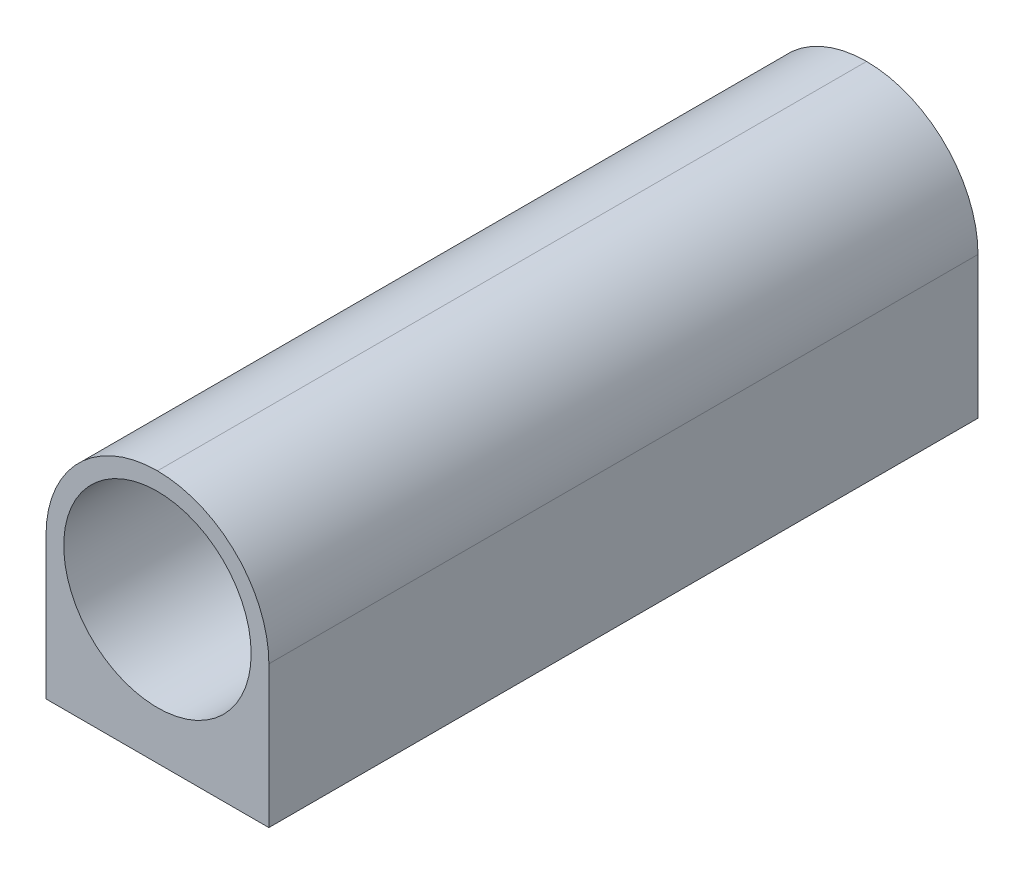
ISO-10303-21;
HEADER;
FILE_DESCRIPTION(('STEP AP214'),'2;1');
FILE_NAME('part.step','',(''),(''),'','','');
FILE_SCHEMA(('AUTOMOTIVE_DESIGN { 1 0 10303 214 1 1 1 1 }'));
ENDSEC;
DATA;
#1=APPLICATION_CONTEXT('core data for automotive mechanical design processes');
#2=APPLICATION_PROTOCOL_DEFINITION('international standard','automotive_design',2000,#1);
#3=PRODUCT_CONTEXT('',#1,'mechanical');
#4=PRODUCT('Part','Part','',(#3));
#5=PRODUCT_RELATED_PRODUCT_CATEGORY('part','',(#4));
#6=PRODUCT_DEFINITION_FORMATION('','',#4);
#7=PRODUCT_DEFINITION_CONTEXT('part definition',#1,'design');
#8=PRODUCT_DEFINITION('design','',#6,#7);
#9=PRODUCT_DEFINITION_SHAPE('','',#8);
#10=(LENGTH_UNIT() NAMED_UNIT(*) SI_UNIT(.MILLI.,.METRE.));
#11=(NAMED_UNIT(*) PLANE_ANGLE_UNIT() SI_UNIT($,.RADIAN.));
#12=(NAMED_UNIT(*) SI_UNIT($,.STERADIAN.) SOLID_ANGLE_UNIT());
#13=UNCERTAINTY_MEASURE_WITH_UNIT(LENGTH_MEASURE(1.E-05),#10,'distance_accuracy_value','');
#14=(GEOMETRIC_REPRESENTATION_CONTEXT(3) GLOBAL_UNCERTAINTY_ASSIGNED_CONTEXT((#13)) GLOBAL_UNIT_ASSIGNED_CONTEXT((#10,
#11,#12)) REPRESENTATION_CONTEXT('',''));
#15=CARTESIAN_POINT('',(0.,0.,0.));
#16=DIRECTION('',(0.,0.,1.));
#17=DIRECTION('',(1.,0.,0.));
#18=AXIS2_PLACEMENT_3D('',#15,#16,#17);
#19=CARTESIAN_POINT('',(0.,0.,70.));
#20=DIRECTION('',(0.,0.,1.));
#21=DIRECTION('',(1.,0.,0.));
#22=AXIS2_PLACEMENT_3D('',#19,#20,#21);
#23=PLANE('',#22);
#24=CARTESIAN_POINT('',(11.,-11.,70.));
#25=DIRECTION('',(0.,0.,1.));
#26=DIRECTION('',(1.,0.,0.));
#27=AXIS2_PLACEMENT_3D('',#24,#25,#26);
#28=CIRCLE('',#27,11.);
#29=CARTESIAN_POINT('',(22.,-11.,70.));
#30=VERTEX_POINT('',#29);
#31=CARTESIAN_POINT('',(11.,0.,70.));
#32=VERTEX_POINT('',#31);
#33=EDGE_CURVE('E62',#30,#32,#28,.T.);
#34=ORIENTED_EDGE('',*,*,#33,.T.);
#35=CARTESIAN_POINT('',(11.,-11.,70.));
#36=DIRECTION('',(0.,0.,1.));
#37=DIRECTION('',(1.,0.,0.));
#38=AXIS2_PLACEMENT_3D('',#35,#36,#37);
#39=CIRCLE('',#38,11.);
#40=CARTESIAN_POINT('',(0.,-11.,70.));
#41=VERTEX_POINT('',#40);
#42=EDGE_CURVE('E54',#32,#41,#39,.T.);
#43=ORIENTED_EDGE('',*,*,#42,.T.);
#44=DIRECTION('',(0.,-1.,0.));
#45=VECTOR('',#44,1.);
#46=CARTESIAN_POINT('',(0.,0.,70.));
#47=LINE('',#46,#45);
#48=CARTESIAN_POINT('',(0.,-25.,70.));
#49=VERTEX_POINT('',#48);
#50=EDGE_CURVE('E143',#41,#49,#47,.T.);
#51=ORIENTED_EDGE('',*,*,#50,.T.);
#52=DIRECTION('',(-1.,0.,0.));
#53=VECTOR('',#52,1.);
#54=CARTESIAN_POINT('',(22.,-25.,70.));
#55=LINE('',#54,#53);
#56=CARTESIAN_POINT('',(22.,-25.,70.));
#57=VERTEX_POINT('',#56);
#58=EDGE_CURVE('E120',#57,#49,#55,.T.);
#59=ORIENTED_EDGE('',*,*,#58,.F.);
#60=DIRECTION('',(0.,1.,0.));
#61=VECTOR('',#60,1.);
#62=CARTESIAN_POINT('',(22.,0.,70.));
#63=LINE('',#62,#61);
#64=EDGE_CURVE('E146',#57,#30,#63,.T.);
#65=ORIENTED_EDGE('',*,*,#64,.T.);
#66=EDGE_LOOP('',(#34,#43,#51,#59,#65));
#67=FACE_BOUND('',#66,.T.);
#68=CARTESIAN_POINT('',(11.,-11.,70.));
#69=DIRECTION('',(0.,0.,1.));
#70=DIRECTION('',(1.,0.,0.));
#71=AXIS2_PLACEMENT_3D('',#68,#69,#70);
#72=CIRCLE('',#71,9.25);
#73=CARTESIAN_POINT('',(20.25,-11.,70.));
#74=VERTEX_POINT('',#73);
#75=EDGE_CURVE('E105',#74,#74,#72,.T.);
#76=ORIENTED_EDGE('',*,*,#75,.F.);
#77=EDGE_LOOP('',(#76));
#78=FACE_BOUND('',#77,.T.);
#79=ADVANCED_FACE('F39',(#67,#78),#23,.T.);
#80=CARTESIAN_POINT('',(0.,0.,0.));
#81=DIRECTION('',(0.,0.,1.));
#82=DIRECTION('',(1.,0.,0.));
#83=AXIS2_PLACEMENT_3D('',#80,#81,#82);
#84=PLANE('',#83);
#85=DIRECTION('',(0.,-1.,0.));
#86=VECTOR('',#85,1.);
#87=CARTESIAN_POINT('',(0.,0.,0.));
#88=LINE('',#87,#86);
#89=CARTESIAN_POINT('',(0.,-11.,0.));
#90=VERTEX_POINT('',#89);
#91=CARTESIAN_POINT('',(0.,-25.,0.));
#92=VERTEX_POINT('',#91);
#93=EDGE_CURVE('E94',#90,#92,#88,.T.);
#94=ORIENTED_EDGE('',*,*,#93,.F.);
#95=CARTESIAN_POINT('',(11.,-11.,0.));
#96=DIRECTION('',(0.,0.,1.));
#97=DIRECTION('',(1.,0.,0.));
#98=AXIS2_PLACEMENT_3D('',#95,#96,#97);
#99=CIRCLE('',#98,11.);
#100=CARTESIAN_POINT('',(11.,0.,0.));
#101=VERTEX_POINT('',#100);
#102=EDGE_CURVE('E156',#90,#101,#99,.F.);
#103=ORIENTED_EDGE('',*,*,#102,.T.);
#104=CARTESIAN_POINT('',(11.,-11.,0.));
#105=DIRECTION('',(0.,0.,1.));
#106=DIRECTION('',(1.,0.,0.));
#107=AXIS2_PLACEMENT_3D('',#104,#105,#106);
#108=CIRCLE('',#107,11.);
#109=CARTESIAN_POINT('',(22.,-11.,0.));
#110=VERTEX_POINT('',#109);
#111=EDGE_CURVE('E153',#101,#110,#108,.F.);
#112=ORIENTED_EDGE('',*,*,#111,.T.);
#113=DIRECTION('',(0.,1.,0.));
#114=VECTOR('',#113,1.);
#115=CARTESIAN_POINT('',(22.,0.,0.));
#116=LINE('',#115,#114);
#117=CARTESIAN_POINT('',(22.,-25.,0.));
#118=VERTEX_POINT('',#117);
#119=EDGE_CURVE('E104',#118,#110,#116,.T.);
#120=ORIENTED_EDGE('',*,*,#119,.F.);
#121=DIRECTION('',(1.,0.,0.));
#122=VECTOR('',#121,1.);
#123=CARTESIAN_POINT('',(0.,-25.,0.));
#124=LINE('',#123,#122);
#125=EDGE_CURVE('E108',#92,#118,#124,.T.);
#126=ORIENTED_EDGE('',*,*,#125,.F.);
#127=EDGE_LOOP('',(#94,#103,#112,#120,#126));
#128=FACE_BOUND('',#127,.T.);
#129=CARTESIAN_POINT('',(11.,-11.,0.));
#130=DIRECTION('',(0.,0.,1.));
#131=DIRECTION('',(1.,0.,0.));
#132=AXIS2_PLACEMENT_3D('',#129,#130,#131);
#133=CIRCLE('',#132,9.25);
#134=CARTESIAN_POINT('',(20.25,-11.,0.));
#135=VERTEX_POINT('',#134);
#136=EDGE_CURVE('E139',#135,#135,#133,.T.);
#137=ORIENTED_EDGE('',*,*,#136,.T.);
#138=EDGE_LOOP('',(#137));
#139=FACE_BOUND('',#138,.T.);
#140=ADVANCED_FACE('F109',(#128,#139),#84,.F.);
#141=CARTESIAN_POINT('',(0.,0.,70.));
#142=DIRECTION('',(1.,0.,0.));
#143=DIRECTION('',(0.,1.,0.));
#144=AXIS2_PLACEMENT_3D('',#141,#142,#143);
#145=PLANE('',#144);
#146=ORIENTED_EDGE('',*,*,#50,.F.);
#147=DIRECTION('',(0.,0.,-1.));
#148=VECTOR('',#147,1.);
#149=CARTESIAN_POINT('',(0.,-11.,70.));
#150=LINE('',#149,#148);
#151=EDGE_CURVE('E101',#41,#90,#150,.T.);
#152=ORIENTED_EDGE('',*,*,#151,.T.);
#153=ORIENTED_EDGE('',*,*,#93,.T.);
#154=DIRECTION('',(0.,0.,-1.));
#155=VECTOR('',#154,1.);
#156=CARTESIAN_POINT('',(0.,-25.,70.));
#157=LINE('',#156,#155);
#158=EDGE_CURVE('E99',#49,#92,#157,.T.);
#159=ORIENTED_EDGE('',*,*,#158,.F.);
#160=EDGE_LOOP('',(#146,#152,#153,#159));
#161=FACE_BOUND('',#160,.T.);
#162=ADVANCED_FACE('F97',(#161),#145,.F.);
#163=CARTESIAN_POINT('',(22.,0.,70.));
#164=DIRECTION('',(-1.,0.,0.));
#165=DIRECTION('',(0.,-1.,0.));
#166=AXIS2_PLACEMENT_3D('',#163,#164,#165);
#167=PLANE('',#166);
#168=ORIENTED_EDGE('',*,*,#119,.T.);
#169=DIRECTION('',(0.,0.,-1.));
#170=VECTOR('',#169,1.);
#171=CARTESIAN_POINT('',(22.,-11.,70.));
#172=LINE('',#171,#170);
#173=EDGE_CURVE('E11',#110,#30,#172,.F.);
#174=ORIENTED_EDGE('',*,*,#173,.T.);
#175=ORIENTED_EDGE('',*,*,#64,.F.);
#176=DIRECTION('',(0.,0.,1.));
#177=VECTOR('',#176,1.);
#178=CARTESIAN_POINT('',(22.,-25.,0.));
#179=LINE('',#178,#177);
#180=EDGE_CURVE('E115',#118,#57,#179,.T.);
#181=ORIENTED_EDGE('',*,*,#180,.F.);
#182=EDGE_LOOP('',(#168,#174,#175,#181));
#183=FACE_BOUND('',#182,.T.);
#184=ADVANCED_FACE('F200',(#183),#167,.F.);
#185=CARTESIAN_POINT('',(11.,-11.,70.));
#186=DIRECTION('',(0.,0.,-1.));
#187=DIRECTION('',(-1.,0.,0.));
#188=AXIS2_PLACEMENT_3D('',#185,#186,#187);
#189=CYLINDRICAL_SURFACE('',#188,9.25);
#190=CARTESIAN_POINT('',(11.,-20.25,5.52211859895944));
#191=CARTESIAN_POINT('',(10.8836412487942,-20.2499978767651,5.52212241086046));
#192=CARTESIAN_POINT('',(10.7672373720922,-20.247782225777,5.53182219744614));
#193=CARTESIAN_POINT('',(10.5377435969402,-20.2391577207198,5.57032029279479));
#194=CARTESIAN_POINT('',(10.4246559964198,-20.2327460276426,5.59913153239141));
#195=CARTESIAN_POINT('',(10.2051439358319,-20.2164423495056,5.67489763660481));
#196=CARTESIAN_POINT('',(10.0987123931771,-20.2065541406026,5.72183282059086));
#197=CARTESIAN_POINT('',(9.89523709445848,-20.1843610444033,5.83245026626212));
#198=CARTESIAN_POINT('',(9.79819324055091,-20.1720561822987,5.89613235337607));
#199=CARTESIAN_POINT('',(9.61457536495438,-20.1461379449788,6.03959507887571));
#200=CARTESIAN_POINT('',(9.52818599687592,-20.1325073090478,6.11960895555864));
#201=CARTESIAN_POINT('',(9.36993147099961,-20.1055935998998,6.29296358049939));
#202=CARTESIAN_POINT('',(9.29806768980873,-20.0923105597286,6.38630559045095));
#203=CARTESIAN_POINT('',(9.17007604321655,-20.0674249083386,6.58504946829859));
#204=CARTESIAN_POINT('',(9.11414727950258,-20.0558443661301,6.69058256954791));
#205=CARTESIAN_POINT('',(9.02089122014678,-20.0359237237809,6.90985640412244));
#206=CARTESIAN_POINT('',(8.98356151440307,-20.0275832038227,7.02359607183703));
#207=CARTESIAN_POINT('',(8.92917849852894,-20.0152631835396,7.25404411263221));
#208=CARTESIAN_POINT('',(8.91179692975016,-20.0112131687492,7.37067116837031));
#209=CARTESIAN_POINT('',(8.89678243151105,-20.007721125135,7.60525086012868));
#210=CARTESIAN_POINT('',(8.89914687929894,-20.0082784843399,7.72320331802491));
#211=CARTESIAN_POINT('',(8.92329370853282,-20.0138744877825,7.95462651474852));
#212=CARTESIAN_POINT('',(8.94469232492178,-20.0188245618935,8.06813976457518));
#213=CARTESIAN_POINT('',(9.00569100455599,-20.0325079331541,8.28992184595389));
#214=CARTESIAN_POINT('',(9.04529215946034,-20.0412414572063,8.39819036253353));
#215=CARTESIAN_POINT('',(9.14191766069493,-20.061593431344,8.60747580882024));
#216=CARTESIAN_POINT('',(9.19908745404983,-20.0732358067877,8.70842316303983));
#217=CARTESIAN_POINT('',(9.32912527197753,-20.0980793114504,8.89943268548136));
#218=CARTESIAN_POINT('',(9.40199559226427,-20.1112806684943,8.98949325884062));
#219=CARTESIAN_POINT('',(9.56338639217238,-20.1381329210169,9.1583797055554));
#220=CARTESIAN_POINT('',(9.65223259771986,-20.151787115197,9.23689411378797));
#221=CARTESIAN_POINT('',(9.84198816593881,-20.1777265286861,9.37796178382469));
#222=CARTESIAN_POINT('',(9.94289778112023,-20.1900117193289,9.44051471143897));
#223=CARTESIAN_POINT('',(10.1543120740785,-20.2118737726886,9.5479700388265));
#224=CARTESIAN_POINT('',(10.2648394807916,-20.2214439789517,9.59282916110342));
#225=CARTESIAN_POINT('',(10.4921297526412,-20.2367486335702,9.66324982270447));
#226=CARTESIAN_POINT('',(10.6088916361321,-20.2424836838758,9.6888143905025));
#227=CARTESIAN_POINT('',(10.8426670007559,-20.2493852968353,9.71946152788405));
#228=CARTESIAN_POINT('',(10.9596220279149,-20.2506466666152,9.7249692153471));
#229=CARTESIAN_POINT('',(11.1927812400264,-20.2487255725785,9.71650198179031));
#230=CARTESIAN_POINT('',(11.3089854794374,-20.2455434347914,9.70252849014664));
#231=CARTESIAN_POINT('',(11.5359185409825,-20.2351529476525,9.65584762652281));
#232=CARTESIAN_POINT('',(11.6466961124351,-20.227993032853,9.62336550122832));
#233=CARTESIAN_POINT('',(11.8612291435984,-20.2104494563138,9.54084126580794));
#234=CARTESIAN_POINT('',(11.9649839732155,-20.2000655057732,9.49079758251053));
#235=CARTESIAN_POINT('',(12.1642674798232,-20.1769933141989,9.37370083567604));
#236=CARTESIAN_POINT('',(12.2596472757145,-20.1642724694171,9.30640096579138));
#237=CARTESIAN_POINT('',(12.4379118455833,-20.1379999248545,9.15702476157398));
#238=CARTESIAN_POINT('',(12.5207948592614,-20.1244481084004,9.07494634909886));
#239=CARTESIAN_POINT('',(12.6734122393283,-20.0977099386521,8.89638569302777));
#240=CARTESIAN_POINT('',(12.7428511605977,-20.0845362778229,8.79964866441813));
#241=CARTESIAN_POINT('',(12.8645007650047,-20.0603531429965,8.59563759966931));
#242=CARTESIAN_POINT('',(12.9167122093427,-20.0493435733872,8.48836402936166));
#243=CARTESIAN_POINT('',(13.0020597475403,-20.0308452050342,8.26690819876695));
#244=CARTESIAN_POINT('',(13.0353057503273,-20.0233361672796,8.15277007188483));
#245=CARTESIAN_POINT('',(13.0820940347418,-20.0126561552524,7.92033322607371));
#246=CARTESIAN_POINT('',(13.0956397505498,-20.0094844249001,7.80203523598091));
#247=CARTESIAN_POINT('',(13.102488101799,-20.0078883769089,7.5676221123891));
#248=CARTESIAN_POINT('',(13.096260040418,-20.0093539953787,7.4515211967327));
#249=CARTESIAN_POINT('',(13.0647931006929,-20.0166171794867,7.22207008919391));
#250=CARTESIAN_POINT('',(13.0395544832861,-20.0224146856656,7.10871985957785));
#251=CARTESIAN_POINT('',(12.9710174072227,-20.0376327458435,6.88839533025846));
#252=CARTESIAN_POINT('',(12.9277922662904,-20.0470385793509,6.78139713858874));
#253=CARTESIAN_POINT('',(12.8245703532663,-20.0684182126478,6.57610351910397));
#254=CARTESIAN_POINT('',(12.7645716805481,-20.0803923034133,6.47780907918296));
#255=CARTESIAN_POINT('',(12.6279709701985,-20.1058842811689,6.29041104414757));
#256=CARTESIAN_POINT('',(12.5510366563503,-20.1194300473177,6.20155340310568));
#257=CARTESIAN_POINT('',(12.3834155455943,-20.1463573780295,6.03785596692241));
#258=CARTESIAN_POINT('',(12.2927255580402,-20.1597389037161,5.96301943302022));
#259=CARTESIAN_POINT('',(12.0986128281152,-20.1850560617982,5.82846473016207));
#260=CARTESIAN_POINT('',(11.9950274157853,-20.1969684370041,5.76897658939665));
#261=CARTESIAN_POINT('',(11.7790753049148,-20.2177691286547,5.66835115763605));
#262=CARTESIAN_POINT('',(11.6667157919698,-20.22665988838,5.62719903170923));
#263=CARTESIAN_POINT('',(11.4619308611932,-20.2388969820252,5.57144260457032));
#264=CARTESIAN_POINT('',(11.3705828201231,-20.2430341317675,5.55298253579728));
#265=CARTESIAN_POINT('',(11.1861660895127,-20.2485864205766,5.52831932131677));
#266=CARTESIAN_POINT('',(11.093097488169,-20.2500016987793,5.52211554909507));
#267=CARTESIAN_POINT('',(11.,-20.25,5.52211859895944));
#268=B_SPLINE_CURVE_WITH_KNOTS('',3,(#190,#191,#192,#193,#194,#195,#196,#197,#198,#199,#200,
#201,#202,#203,#204,#205,#206,#207,#208,#209,#210,#211,#212,#213,#214,#215,#216,#217,#218,#219,
#220,#221,#222,#223,#224,#225,#226,#227,#228,#229,#230,#231,#232,#233,#234,#235,#236,#237,#238,
#239,#240,#241,#242,#243,#244,#245,#246,#247,#248,#249,#250,#251,#252,#253,#254,#255,#256,#257,
#258,#259,#260,#261,#262,#263,#264,#265,#266,#267),.UNSPECIFIED.,.T.,.F.,(4,2,2,2,2,2,2,2,2,2,2,
2,2,2,2,2,2,2,2,2,2,2,2,2,2,2,2,2,2,2,2,2,2,2,2,2,2,2,4),(0.,0.348735382710213,
0.697706961231073,1.04630065543056,1.39489071600127,1.7488595062712,2.10286182686725,
2.46111060023942,2.81931293896128,3.17153228736405,3.52370485320559,3.8689339492291,
4.21418375234608,4.56237252971286,4.91061225345601,5.26698409255174,5.62336339248994,
5.98060903840455,6.33779859936312,6.68737173949126,7.03691923203325,7.38230097296657,
7.72771366123789,8.07837273887417,8.42908116436866,8.78678924830058,9.14448152469622,
9.50007926848733,9.85561501656982,10.2027762452739,10.5499327089558,10.8956877243814,
11.2414819335552,11.5947857061662,11.9481715537197,12.3065807543951,12.6646994517246,
12.943733452742,13.2227531898013),.UNSPECIFIED.);
#269=CARTESIAN_POINT('',(11.,-20.25,5.52211859895944));
#270=VERTEX_POINT('',#269);
#271=EDGE_CURVE('E43',#270,#270,#268,.T.);
#272=ORIENTED_EDGE('',*,*,#271,.F.);
#273=EDGE_LOOP('',(#272));
#274=FACE_BOUND('',#273,.T.);
#275=CARTESIAN_POINT('',(11.,-20.25,15.5221185989594));
#276=CARTESIAN_POINT('',(10.8836412487942,-20.2499978767651,15.5221224108605));
#277=CARTESIAN_POINT('',(10.7672373720922,-20.247782225777,15.5318221974461));
#278=CARTESIAN_POINT('',(10.5377435969402,-20.2391577207198,15.5703202927948));
#279=CARTESIAN_POINT('',(10.4246559964198,-20.2327460276426,15.5991315323914));
#280=CARTESIAN_POINT('',(10.2051439358319,-20.2164423495056,15.6748976366048));
#281=CARTESIAN_POINT('',(10.0987123931771,-20.2065541406026,15.7218328205909));
#282=CARTESIAN_POINT('',(9.89523709445848,-20.1843610444033,15.8324502662621));
#283=CARTESIAN_POINT('',(9.79819324055091,-20.1720561822987,15.8961323533761));
#284=CARTESIAN_POINT('',(9.61457536495438,-20.1461379449788,16.0395950788757));
#285=CARTESIAN_POINT('',(9.52818599687591,-20.1325073090478,16.1196089555586));
#286=CARTESIAN_POINT('',(9.36993147099961,-20.1055935998998,16.2929635804994));
#287=CARTESIAN_POINT('',(9.29806768980873,-20.0923105597286,16.386305590451));
#288=CARTESIAN_POINT('',(9.17007604321655,-20.0674249083386,16.5850494682986));
#289=CARTESIAN_POINT('',(9.11414727950258,-20.0558443661301,16.6905825695479));
#290=CARTESIAN_POINT('',(9.02089122014678,-20.0359237237809,16.9098564041224));
#291=CARTESIAN_POINT('',(8.98356151440307,-20.0275832038227,17.023596071837));
#292=CARTESIAN_POINT('',(8.92917849852894,-20.0152631835396,17.2540441126322));
#293=CARTESIAN_POINT('',(8.91179692975016,-20.0112131687492,17.3706711683703));
#294=CARTESIAN_POINT('',(8.89678243151105,-20.007721125135,17.6052508601287));
#295=CARTESIAN_POINT('',(8.89914687929895,-20.0082784843399,17.7232033180249));
#296=CARTESIAN_POINT('',(8.92329370853282,-20.0138744877825,17.9546265147485));
#297=CARTESIAN_POINT('',(8.94469232492178,-20.0188245618935,18.0681397645752));
#298=CARTESIAN_POINT('',(9.00569100455599,-20.0325079331541,18.2899218459539));
#299=CARTESIAN_POINT('',(9.04529215946034,-20.0412414572063,18.3981903625335));
#300=CARTESIAN_POINT('',(9.14191766069493,-20.061593431344,18.6074758088202));
#301=CARTESIAN_POINT('',(9.19908745404983,-20.0732358067877,18.7084231630398));
#302=CARTESIAN_POINT('',(9.32912527197752,-20.0980793114504,18.8994326854814));
#303=CARTESIAN_POINT('',(9.40199559226426,-20.1112806684943,18.9894932588406));
#304=CARTESIAN_POINT('',(9.56338639217238,-20.1381329210169,19.1583797055554));
#305=CARTESIAN_POINT('',(9.65223259771986,-20.151787115197,19.236894113788));
#306=CARTESIAN_POINT('',(9.84198816593881,-20.1777265286861,19.3779617838247));
#307=CARTESIAN_POINT('',(9.94289778112024,-20.1900117193289,19.440514711439));
#308=CARTESIAN_POINT('',(10.1543120740785,-20.2118737726886,19.5479700388265));
#309=CARTESIAN_POINT('',(10.2648394807916,-20.2214439789517,19.5928291611034));
#310=CARTESIAN_POINT('',(10.4921297526412,-20.2367486335702,19.6632498227045));
#311=CARTESIAN_POINT('',(10.6088916361321,-20.2424836838758,19.6888143905025));
#312=CARTESIAN_POINT('',(10.8426670007559,-20.2493852968353,19.719461527884));
#313=CARTESIAN_POINT('',(10.9596220279149,-20.2506466666152,19.7249692153471));
#314=CARTESIAN_POINT('',(11.1927812400264,-20.2487255725785,19.7165019817903));
#315=CARTESIAN_POINT('',(11.3089854794374,-20.2455434347914,19.7025284901466));
#316=CARTESIAN_POINT('',(11.5359185409825,-20.2351529476525,19.6558476265228));
#317=CARTESIAN_POINT('',(11.6466961124351,-20.227993032853,19.6233655012283));
#318=CARTESIAN_POINT('',(11.8612291435984,-20.2104494563138,19.5408412658079));
#319=CARTESIAN_POINT('',(11.9649839732155,-20.2000655057732,19.4907975825105));
#320=CARTESIAN_POINT('',(12.1642674798232,-20.1769933141989,19.373700835676));
#321=CARTESIAN_POINT('',(12.2596472757145,-20.1642724694171,19.3064009657914));
#322=CARTESIAN_POINT('',(12.4379118455833,-20.1379999248545,19.157024761574));
#323=CARTESIAN_POINT('',(12.5207948592614,-20.1244481084004,19.0749463490989));
#324=CARTESIAN_POINT('',(12.6734122393283,-20.0977099386521,18.8963856930278));
#325=CARTESIAN_POINT('',(12.7428511605977,-20.0845362778229,18.7996486644181));
#326=CARTESIAN_POINT('',(12.8645007650047,-20.0603531429965,18.5956375996693));
#327=CARTESIAN_POINT('',(12.9167122093427,-20.0493435733872,18.4883640293617));
#328=CARTESIAN_POINT('',(13.0020597475403,-20.0308452050342,18.2669081987669));
#329=CARTESIAN_POINT('',(13.0353057503273,-20.0233361672796,18.1527700718848));
#330=CARTESIAN_POINT('',(13.0820940347418,-20.0126561552524,17.9203332260737));
#331=CARTESIAN_POINT('',(13.0956397505498,-20.0094844249001,17.8020352359809));
#332=CARTESIAN_POINT('',(13.102488101799,-20.0078883769089,17.5676221123891));
#333=CARTESIAN_POINT('',(13.096260040418,-20.0093539953787,17.4515211967327));
#334=CARTESIAN_POINT('',(13.0647931006929,-20.0166171794867,17.2220700891939));
#335=CARTESIAN_POINT('',(13.0395544832861,-20.0224146856656,17.1087198595778));
#336=CARTESIAN_POINT('',(12.9710174072227,-20.0376327458435,16.8883953302585));
#337=CARTESIAN_POINT('',(12.9277922662904,-20.0470385793509,16.7813971385887));
#338=CARTESIAN_POINT('',(12.8245703532663,-20.0684182126478,16.576103519104));
#339=CARTESIAN_POINT('',(12.7645716805481,-20.0803923034133,16.477809079183));
#340=CARTESIAN_POINT('',(12.6279709701985,-20.1058842811689,16.2904110441476));
#341=CARTESIAN_POINT('',(12.5510366563503,-20.1194300473177,16.2015534031057));
#342=CARTESIAN_POINT('',(12.3834155455943,-20.1463573780295,16.0378559669224));
#343=CARTESIAN_POINT('',(12.2927255580402,-20.1597389037161,15.9630194330202));
#344=CARTESIAN_POINT('',(12.0986128281152,-20.1850560617982,15.8284647301621));
#345=CARTESIAN_POINT('',(11.9950274157853,-20.1969684370041,15.7689765893966));
#346=CARTESIAN_POINT('',(11.7790753049148,-20.2177691286547,15.668351157636));
#347=CARTESIAN_POINT('',(11.6667157919698,-20.22665988838,15.6271990317092));
#348=CARTESIAN_POINT('',(11.4619308611932,-20.2388969820252,15.5714426045703));
#349=CARTESIAN_POINT('',(11.3705828201231,-20.2430341317675,15.5529825357973));
#350=CARTESIAN_POINT('',(11.1861660895127,-20.2485864205766,15.5283193213168));
#351=CARTESIAN_POINT('',(11.093097488169,-20.2500016987793,15.5221155490951));
#352=CARTESIAN_POINT('',(11.,-20.25,15.5221185989594));
#353=B_SPLINE_CURVE_WITH_KNOTS('',3,(#275,#276,#277,#278,#279,#280,#281,#282,#283,#284,#285,
#286,#287,#288,#289,#290,#291,#292,#293,#294,#295,#296,#297,#298,#299,#300,#301,#302,#303,#304,
#305,#306,#307,#308,#309,#310,#311,#312,#313,#314,#315,#316,#317,#318,#319,#320,#321,#322,#323,
#324,#325,#326,#327,#328,#329,#330,#331,#332,#333,#334,#335,#336,#337,#338,#339,#340,#341,#342,
#343,#344,#345,#346,#347,#348,#349,#350,#351,#352),.UNSPECIFIED.,.T.,.F.,(4,2,2,2,2,2,2,2,2,2,2,
2,2,2,2,2,2,2,2,2,2,2,2,2,2,2,2,2,2,2,2,2,2,2,2,2,2,2,4),(0.,0.348735382710213,
0.697706961231076,1.04630065543057,1.39489071600127,1.7488595062712,2.10286182686725,
2.46111060023942,2.81931293896128,3.17153228736406,3.52370485320559,3.8689339492291,
4.21418375234608,4.56237252971285,4.91061225345601,5.26698409255174,5.62336339248994,
5.98060903840455,6.33779859936312,6.68737173949126,7.03691923203325,7.38230097296658,
7.7277136612379,8.07837273887417,8.42908116436866,8.78678924830058,9.14448152469623,
9.50007926848733,9.85561501656981,10.2027762452739,10.5499327089558,10.8956877243814,
11.2414819335552,11.5947857061662,11.9481715537197,12.3065807543951,12.6646994517246,
12.943733452742,13.2227531898013),.UNSPECIFIED.);
#354=CARTESIAN_POINT('',(11.,-20.25,15.5221185989594));
#355=VERTEX_POINT('',#354);
#356=EDGE_CURVE('E169',#355,#355,#353,.T.);
#357=ORIENTED_EDGE('',*,*,#356,.F.);
#358=EDGE_LOOP('',(#357));
#359=FACE_BOUND('',#358,.T.);
#360=CARTESIAN_POINT('',(11.,-20.25,25.5221185989594));
#361=CARTESIAN_POINT('',(10.8836412487942,-20.2499978767651,25.5221224108605));
#362=CARTESIAN_POINT('',(10.7672373720922,-20.247782225777,25.5318221974461));
#363=CARTESIAN_POINT('',(10.5377435969402,-20.2391577207198,25.5703202927948));
#364=CARTESIAN_POINT('',(10.4246559964198,-20.2327460276426,25.5991315323914));
#365=CARTESIAN_POINT('',(10.2051439358319,-20.2164423495056,25.6748976366048));
#366=CARTESIAN_POINT('',(10.0987123931771,-20.2065541406026,25.7218328205909));
#367=CARTESIAN_POINT('',(9.89523709445848,-20.1843610444033,25.8324502662621));
#368=CARTESIAN_POINT('',(9.79819324055091,-20.1720561822987,25.8961323533761));
#369=CARTESIAN_POINT('',(9.61457536495438,-20.1461379449788,26.0395950788757));
#370=CARTESIAN_POINT('',(9.52818599687592,-20.1325073090478,26.1196089555586));
#371=CARTESIAN_POINT('',(9.36993147099961,-20.1055935998998,26.2929635804994));
#372=CARTESIAN_POINT('',(9.29806768980873,-20.0923105597286,26.386305590451));
#373=CARTESIAN_POINT('',(9.17007604321655,-20.0674249083386,26.5850494682986));
#374=CARTESIAN_POINT('',(9.11414727950258,-20.0558443661301,26.6905825695479));
#375=CARTESIAN_POINT('',(9.02089122014679,-20.0359237237809,26.9098564041224));
#376=CARTESIAN_POINT('',(8.98356151440307,-20.0275832038227,27.023596071837));
#377=CARTESIAN_POINT('',(8.92917849852894,-20.0152631835396,27.2540441126322));
#378=CARTESIAN_POINT('',(8.91179692975016,-20.0112131687492,27.3706711683703));
#379=CARTESIAN_POINT('',(8.89678243151105,-20.007721125135,27.6052508601287));
#380=CARTESIAN_POINT('',(8.89914687929895,-20.0082784843399,27.7232033180249));
#381=CARTESIAN_POINT('',(8.92329370853282,-20.0138744877825,27.9546265147485));
#382=CARTESIAN_POINT('',(8.94469232492178,-20.0188245618935,28.0681397645752));
#383=CARTESIAN_POINT('',(9.00569100455599,-20.0325079331541,28.2899218459539));
#384=CARTESIAN_POINT('',(9.04529215946034,-20.0412414572063,28.3981903625335));
#385=CARTESIAN_POINT('',(9.14191766069493,-20.061593431344,28.6074758088202));
#386=CARTESIAN_POINT('',(9.19908745404983,-20.0732358067877,28.7084231630398));
#387=CARTESIAN_POINT('',(9.32912527197752,-20.0980793114504,28.8994326854814));
#388=CARTESIAN_POINT('',(9.40199559226427,-20.1112806684943,28.9894932588406));
#389=CARTESIAN_POINT('',(9.56338639217238,-20.1381329210169,29.1583797055554));
#390=CARTESIAN_POINT('',(9.65223259771986,-20.151787115197,29.236894113788));
#391=CARTESIAN_POINT('',(9.84198816593881,-20.1777265286861,29.3779617838247));
#392=CARTESIAN_POINT('',(9.94289778112024,-20.1900117193289,29.440514711439));
#393=CARTESIAN_POINT('',(10.1543120740785,-20.2118737726886,29.5479700388265));
#394=CARTESIAN_POINT('',(10.2648394807916,-20.2214439789517,29.5928291611034));
#395=CARTESIAN_POINT('',(10.4921297526412,-20.2367486335702,29.6632498227045));
#396=CARTESIAN_POINT('',(10.6088916361321,-20.2424836838758,29.6888143905025));
#397=CARTESIAN_POINT('',(10.8426670007559,-20.2493852968353,29.719461527884));
#398=CARTESIAN_POINT('',(10.9596220279149,-20.2506466666152,29.7249692153471));
#399=CARTESIAN_POINT('',(11.1927812400264,-20.2487255725785,29.7165019817903));
#400=CARTESIAN_POINT('',(11.3089854794374,-20.2455434347914,29.7025284901466));
#401=CARTESIAN_POINT('',(11.5359185409825,-20.2351529476525,29.6558476265228));
#402=CARTESIAN_POINT('',(11.6466961124351,-20.227993032853,29.6233655012283));
#403=CARTESIAN_POINT('',(11.8612291435984,-20.2104494563138,29.5408412658079));
#404=CARTESIAN_POINT('',(11.9649839732155,-20.2000655057732,29.4907975825105));
#405=CARTESIAN_POINT('',(12.1642674798232,-20.1769933141989,29.373700835676));
#406=CARTESIAN_POINT('',(12.2596472757145,-20.1642724694171,29.3064009657914));
#407=CARTESIAN_POINT('',(12.4379118455833,-20.1379999248545,29.157024761574));
#408=CARTESIAN_POINT('',(12.5207948592614,-20.1244481084004,29.0749463490989));
#409=CARTESIAN_POINT('',(12.6734122393283,-20.0977099386521,28.8963856930278));
#410=CARTESIAN_POINT('',(12.7428511605977,-20.0845362778229,28.7996486644181));
#411=CARTESIAN_POINT('',(12.8645007650047,-20.0603531429965,28.5956375996693));
#412=CARTESIAN_POINT('',(12.9167122093427,-20.0493435733872,28.4883640293617));
#413=CARTESIAN_POINT('',(13.0020597475403,-20.0308452050342,28.2669081987669));
#414=CARTESIAN_POINT('',(13.0353057503273,-20.0233361672796,28.1527700718848));
#415=CARTESIAN_POINT('',(13.0820940347418,-20.0126561552524,27.9203332260737));
#416=CARTESIAN_POINT('',(13.0956397505498,-20.0094844249001,27.8020352359809));
#417=CARTESIAN_POINT('',(13.102488101799,-20.0078883769089,27.5676221123891));
#418=CARTESIAN_POINT('',(13.096260040418,-20.0093539953787,27.4515211967327));
#419=CARTESIAN_POINT('',(13.0647931006929,-20.0166171794867,27.2220700891939));
#420=CARTESIAN_POINT('',(13.0395544832861,-20.0224146856656,27.1087198595778));
#421=CARTESIAN_POINT('',(12.9710174072227,-20.0376327458435,26.8883953302585));
#422=CARTESIAN_POINT('',(12.9277922662904,-20.0470385793509,26.7813971385887));
#423=CARTESIAN_POINT('',(12.8245703532662,-20.0684182126478,26.576103519104));
#424=CARTESIAN_POINT('',(12.7645716805481,-20.0803923034133,26.477809079183));
#425=CARTESIAN_POINT('',(12.6279709701985,-20.1058842811689,26.2904110441476));
#426=CARTESIAN_POINT('',(12.5510366563503,-20.1194300473177,26.2015534031057));
#427=CARTESIAN_POINT('',(12.3834155455943,-20.1463573780295,26.0378559669224));
#428=CARTESIAN_POINT('',(12.2927255580402,-20.1597389037161,25.9630194330202));
#429=CARTESIAN_POINT('',(12.0986128281152,-20.1850560617982,25.8284647301621));
#430=CARTESIAN_POINT('',(11.9950274157852,-20.1969684370041,25.7689765893966));
#431=CARTESIAN_POINT('',(11.7790753049148,-20.2177691286547,25.668351157636));
#432=CARTESIAN_POINT('',(11.6667157919698,-20.22665988838,25.6271990317092));
#433=CARTESIAN_POINT('',(11.4619308611932,-20.2388969820252,25.5714426045703));
#434=CARTESIAN_POINT('',(11.3705828201231,-20.2430341317675,25.5529825357973));
#435=CARTESIAN_POINT('',(11.1861660895127,-20.2485864205766,25.5283193213168));
#436=CARTESIAN_POINT('',(11.093097488169,-20.2500016987793,25.5221155490951));
#437=CARTESIAN_POINT('',(11.,-20.25,25.5221185989594));
#438=B_SPLINE_CURVE_WITH_KNOTS('',3,(#360,#361,#362,#363,#364,#365,#366,#367,#368,#369,#370,
#371,#372,#373,#374,#375,#376,#377,#378,#379,#380,#381,#382,#383,#384,#385,#386,#387,#388,#389,
#390,#391,#392,#393,#394,#395,#396,#397,#398,#399,#400,#401,#402,#403,#404,#405,#406,#407,#408,
#409,#410,#411,#412,#413,#414,#415,#416,#417,#418,#419,#420,#421,#422,#423,#424,#425,#426,#427,
#428,#429,#430,#431,#432,#433,#434,#435,#436,#437),.UNSPECIFIED.,.T.,.F.,(4,2,2,2,2,2,2,2,2,2,2,
2,2,2,2,2,2,2,2,2,2,2,2,2,2,2,2,2,2,2,2,2,2,2,2,2,2,2,4),(0.,0.348735382710215,
0.697706961231076,1.04630065543057,1.39489071600127,1.7488595062712,2.10286182686725,
2.46111060023942,2.81931293896128,3.17153228736405,3.52370485320559,3.8689339492291,
4.21418375234608,4.56237252971286,4.91061225345602,5.26698409255174,5.62336339248994,
5.98060903840455,6.33779859936312,6.68737173949126,7.03691923203325,7.38230097296658,
7.7277136612379,8.07837273887417,8.42908116436866,8.78678924830058,9.14448152469623,
9.50007926848733,9.85561501656982,10.2027762452739,10.5499327089558,10.8956877243814,
11.2414819335552,11.5947857061662,11.9481715537197,12.3065807543951,12.6646994517246,
12.943733452742,13.2227531898013),.UNSPECIFIED.);
#439=CARTESIAN_POINT('',(11.,-20.25,25.5221185989594));
#440=VERTEX_POINT('',#439);
#441=EDGE_CURVE('E122',#440,#440,#438,.T.);
#442=ORIENTED_EDGE('',*,*,#441,.F.);
#443=EDGE_LOOP('',(#442));
#444=FACE_BOUND('',#443,.T.);
#445=ORIENTED_EDGE('',*,*,#75,.T.);
#446=EDGE_LOOP('',(#445));
#447=FACE_BOUND('',#446,.T.);
#448=ORIENTED_EDGE('',*,*,#136,.F.);
#449=EDGE_LOOP('',(#448));
#450=FACE_BOUND('',#449,.T.);
#451=ADVANCED_FACE('F174',(#274,#359,#444,#447,#450),#189,.F.);
#452=CARTESIAN_POINT('',(11.,-11.,70.));
#453=DIRECTION('',(0.,0.,-1.));
#454=DIRECTION('',(-1.,0.,0.));
#455=AXIS2_PLACEMENT_3D('',#452,#453,#454);
#456=CYLINDRICAL_SURFACE('',#455,11.);
#457=DIRECTION('',(0.,0.,-1.));
#458=VECTOR('',#457,1.);
#459=CARTESIAN_POINT('',(11.,0.,70.));
#460=LINE('',#459,#458);
#461=EDGE_CURVE('E135',#32,#101,#460,.T.);
#462=ORIENTED_EDGE('',*,*,#461,.F.);
#463=ORIENTED_EDGE('',*,*,#33,.F.);
#464=ORIENTED_EDGE('',*,*,#173,.F.);
#465=ORIENTED_EDGE('',*,*,#111,.F.);
#466=EDGE_LOOP('',(#462,#463,#464,#465));
#467=FACE_BOUND('',#466,.T.);
#468=ADVANCED_FACE('F41',(#467),#456,.T.);
#469=CARTESIAN_POINT('',(11.,-11.,70.));
#470=DIRECTION('',(0.,0.,-1.));
#471=DIRECTION('',(-1.,0.,0.));
#472=AXIS2_PLACEMENT_3D('',#469,#470,#471);
#473=CYLINDRICAL_SURFACE('',#472,11.);
#474=ORIENTED_EDGE('',*,*,#42,.F.);
#475=ORIENTED_EDGE('',*,*,#461,.T.);
#476=ORIENTED_EDGE('',*,*,#102,.F.);
#477=ORIENTED_EDGE('',*,*,#151,.F.);
#478=EDGE_LOOP('',(#474,#475,#476,#477));
#479=FACE_BOUND('',#478,.T.);
#480=ADVANCED_FACE('F185',(#479),#473,.T.);
#481=CARTESIAN_POINT('',(0.,-25.,0.));
#482=DIRECTION('',(0.,-1.,0.));
#483=DIRECTION('',(0.,0.,-1.));
#484=AXIS2_PLACEMENT_3D('',#481,#482,#483);
#485=PLANE('',#484);
#486=CARTESIAN_POINT('',(11.,-25.,7.62211859895943));
#487=DIRECTION('',(0.,-1.,0.));
#488=DIRECTION('',(0.,0.,-1.));
#489=AXIS2_PLACEMENT_3D('',#486,#487,#488);
#490=CIRCLE('',#489,2.09999999999999);
#491=CARTESIAN_POINT('',(11.,-25.,5.52211859895944));
#492=VERTEX_POINT('',#491);
#493=EDGE_CURVE('E286',#492,#492,#490,.T.);
#494=ORIENTED_EDGE('',*,*,#493,.F.);
#495=EDGE_LOOP('',(#494));
#496=FACE_BOUND('',#495,.T.);
#497=CARTESIAN_POINT('',(11.,-25.,17.6221185989594));
#498=DIRECTION('',(0.,-1.,0.));
#499=DIRECTION('',(0.,0.,-1.));
#500=AXIS2_PLACEMENT_3D('',#497,#498,#499);
#501=CIRCLE('',#500,2.09999999999999);
#502=CARTESIAN_POINT('',(11.,-25.,15.5221185989594));
#503=VERTEX_POINT('',#502);
#504=EDGE_CURVE('E290',#503,#503,#501,.T.);
#505=ORIENTED_EDGE('',*,*,#504,.F.);
#506=EDGE_LOOP('',(#505));
#507=FACE_BOUND('',#506,.T.);
#508=CARTESIAN_POINT('',(11.,-25.,27.6221185989594));
#509=DIRECTION('',(0.,-1.,0.));
#510=DIRECTION('',(0.,0.,-1.));
#511=AXIS2_PLACEMENT_3D('',#508,#509,#510);
#512=CIRCLE('',#511,2.09999999999999);
#513=CARTESIAN_POINT('',(11.,-25.,25.5221185989594));
#514=VERTEX_POINT('',#513);
#515=EDGE_CURVE('E126',#514,#514,#512,.T.);
#516=ORIENTED_EDGE('',*,*,#515,.F.);
#517=EDGE_LOOP('',(#516));
#518=FACE_BOUND('',#517,.T.);
#519=ORIENTED_EDGE('',*,*,#158,.T.);
#520=ORIENTED_EDGE('',*,*,#125,.T.);
#521=ORIENTED_EDGE('',*,*,#180,.T.);
#522=ORIENTED_EDGE('',*,*,#58,.T.);
#523=EDGE_LOOP('',(#519,#520,#521,#522));
#524=FACE_BOUND('',#523,.T.);
#525=ADVANCED_FACE('F118',(#496,#507,#518,#524),#485,.T.);
#526=CARTESIAN_POINT('',(11.,-25.,27.6221185989594));
#527=DIRECTION('',(0.,-1.,0.));
#528=DIRECTION('',(0.,0.,-1.));
#529=AXIS2_PLACEMENT_3D('',#526,#527,#528);
#530=CYLINDRICAL_SURFACE('',#529,2.09999999999999);
#531=ORIENTED_EDGE('',*,*,#441,.T.);
#532=EDGE_LOOP('',(#531));
#533=FACE_BOUND('',#532,.T.);
#534=ORIENTED_EDGE('',*,*,#515,.T.);
#535=EDGE_LOOP('',(#534));
#536=FACE_BOUND('',#535,.T.);
#537=ADVANCED_FACE('F178',(#533,#536),#530,.F.);
#538=CARTESIAN_POINT('',(11.,-25.,17.6221185989594));
#539=DIRECTION('',(0.,-1.,0.));
#540=DIRECTION('',(0.,0.,-1.));
#541=AXIS2_PLACEMENT_3D('',#538,#539,#540);
#542=CYLINDRICAL_SURFACE('',#541,2.09999999999999);
#543=ORIENTED_EDGE('',*,*,#356,.T.);
#544=EDGE_LOOP('',(#543));
#545=FACE_BOUND('',#544,.T.);
#546=ORIENTED_EDGE('',*,*,#504,.T.);
#547=EDGE_LOOP('',(#546));
#548=FACE_BOUND('',#547,.T.);
#549=ADVANCED_FACE('F181',(#545,#548),#542,.F.);
#550=CARTESIAN_POINT('',(11.,-25.,7.62211859895943));
#551=DIRECTION('',(0.,-1.,0.));
#552=DIRECTION('',(0.,0.,-1.));
#553=AXIS2_PLACEMENT_3D('',#550,#551,#552);
#554=CYLINDRICAL_SURFACE('',#553,2.09999999999999);
#555=ORIENTED_EDGE('',*,*,#271,.T.);
#556=EDGE_LOOP('',(#555));
#557=FACE_BOUND('',#556,.T.);
#558=ORIENTED_EDGE('',*,*,#493,.T.);
#559=EDGE_LOOP('',(#558));
#560=FACE_BOUND('',#559,.T.);
#561=ADVANCED_FACE('F269',(#557,#560),#554,.F.);
#562=CLOSED_SHELL('',(#79,#140,#162,#184,#451,#468,#480,#525,#537,#549,#561));
#563=MANIFOLD_SOLID_BREP('B2',#562);
#564=ADVANCED_BREP_SHAPE_REPRESENTATION('',(#18,#563),#14);
#565=SHAPE_DEFINITION_REPRESENTATION(#9,#564);
ENDSEC;
END-ISO-10303-21;
